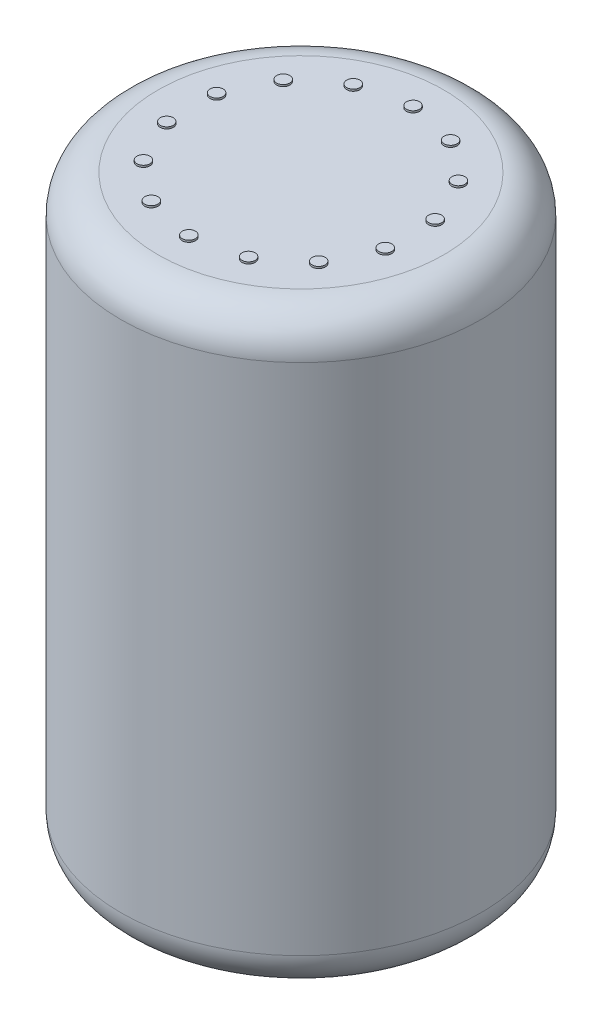
ISO-10303-21;
HEADER;
FILE_DESCRIPTION(('STEP AP214'),'2;1');
FILE_NAME('part.step','',(''),(''),'','','');
FILE_SCHEMA(('AUTOMOTIVE_DESIGN { 1 0 10303 214 1 1 1 1 }'));
ENDSEC;
DATA;
#1=APPLICATION_CONTEXT('core data for automotive mechanical design processes');
#2=APPLICATION_PROTOCOL_DEFINITION('international standard','automotive_design',2000,#1);
#3=PRODUCT_CONTEXT('',#1,'mechanical');
#4=PRODUCT('Part','Part','',(#3));
#5=PRODUCT_RELATED_PRODUCT_CATEGORY('part','',(#4));
#6=PRODUCT_DEFINITION_FORMATION('','',#4);
#7=PRODUCT_DEFINITION_CONTEXT('part definition',#1,'design');
#8=PRODUCT_DEFINITION('design','',#6,#7);
#9=PRODUCT_DEFINITION_SHAPE('','',#8);
#10=(LENGTH_UNIT() NAMED_UNIT(*) SI_UNIT(.MILLI.,.METRE.));
#11=(NAMED_UNIT(*) PLANE_ANGLE_UNIT() SI_UNIT($,.RADIAN.));
#12=(NAMED_UNIT(*) SI_UNIT($,.STERADIAN.) SOLID_ANGLE_UNIT());
#13=UNCERTAINTY_MEASURE_WITH_UNIT(LENGTH_MEASURE(1.E-05),#10,'distance_accuracy_value','');
#14=(GEOMETRIC_REPRESENTATION_CONTEXT(3) GLOBAL_UNCERTAINTY_ASSIGNED_CONTEXT((#13)) GLOBAL_UNIT_ASSIGNED_CONTEXT((#10,
#11,#12)) REPRESENTATION_CONTEXT('',''));
#15=CARTESIAN_POINT('',(0.,0.,0.));
#16=DIRECTION('',(0.,0.,1.));
#17=DIRECTION('',(1.,0.,0.));
#18=AXIS2_PLACEMENT_3D('',#15,#16,#17);
#19=CARTESIAN_POINT('',(0.,31.5,0.));
#20=DIRECTION('',(0.,1.,0.));
#21=DIRECTION('',(0.,0.,1.));
#22=AXIS2_PLACEMENT_3D('',#19,#20,#21);
#23=PLANE('',#22);
#24=CARTESIAN_POINT('',(4.69098889480813,31.5,-3.74093881115246));
#25=DIRECTION('',(0.,1.,0.));
#26=DIRECTION('',(-0.781831482468022,0.,0.623489801858743));
#27=AXIS2_PLACEMENT_3D('',#24,#25,#26);
#28=CIRCLE('',#27,0.35);
#29=CARTESIAN_POINT('',(4.41734787594433,31.5,-3.5227173805019));
#30=VERTEX_POINT('',#29);
#31=EDGE_CURVE('E127',#30,#30,#28,.T.);
#32=ORIENTED_EDGE('',*,*,#31,.F.);
#33=EDGE_LOOP('',(#32));
#34=FACE_BOUND('',#33,.T.);
#35=CARTESIAN_POINT('',(5.84956747309095,31.5,1.33512560373783));
#36=DIRECTION('',(0.,1.,0.));
#37=DIRECTION('',(-0.974927912181826,0.,-0.222520933956305));
#38=AXIS2_PLACEMENT_3D('',#35,#36,#37);
#39=CIRCLE('',#38,0.35);
#40=CARTESIAN_POINT('',(5.50834270382732,31.5,1.25724327685312));
#41=VERTEX_POINT('',#40);
#42=EDGE_CURVE('E115',#41,#41,#39,.T.);
#43=ORIENTED_EDGE('',*,*,#42,.F.);
#44=EDGE_LOOP('',(#43));
#45=FACE_BOUND('',#44,.T.);
#46=CARTESIAN_POINT('',(2.60330243470539,31.5,5.40581320741449));
#47=DIRECTION('',(0.,1.,0.));
#48=DIRECTION('',(-0.433883739117565,0.,-0.900968867902416));
#49=AXIS2_PLACEMENT_3D('',#46,#47,#48);
#50=CIRCLE('',#49,0.35);
#51=CARTESIAN_POINT('',(2.45144312601424,31.5,5.09047410364865));
#52=VERTEX_POINT('',#51);
#53=EDGE_CURVE('E103',#52,#52,#50,.T.);
#54=ORIENTED_EDGE('',*,*,#53,.F.);
#55=EDGE_LOOP('',(#54));
#56=FACE_BOUND('',#55,.T.);
#57=CARTESIAN_POINT('',(-2.60330243470532,31.5,5.40581320741453));
#58=DIRECTION('',(0.,1.,0.));
#59=DIRECTION('',(0.433883739117553,0.,-0.900968867902422));
#60=AXIS2_PLACEMENT_3D('',#57,#58,#59);
#61=CIRCLE('',#60,0.35);
#62=CARTESIAN_POINT('',(-2.45144312601417,31.5,5.09047410364868));
#63=VERTEX_POINT('',#62);
#64=EDGE_CURVE('E91',#63,#63,#61,.T.);
#65=ORIENTED_EDGE('',*,*,#64,.F.);
#66=EDGE_LOOP('',(#65));
#67=FACE_BOUND('',#66,.T.);
#68=CARTESIAN_POINT('',(-5.84956747309094,31.5,1.33512560373791));
#69=DIRECTION('',(0.,1.,0.));
#70=DIRECTION('',(0.974927912181823,0.,-0.222520933956318));
#71=AXIS2_PLACEMENT_3D('',#68,#69,#70);
#72=CIRCLE('',#71,0.35);
#73=CARTESIAN_POINT('',(-5.5083427038273,31.5,1.2572432768532));
#74=VERTEX_POINT('',#73);
#75=EDGE_CURVE('E79',#74,#74,#72,.T.);
#76=ORIENTED_EDGE('',*,*,#75,.F.);
#77=EDGE_LOOP('',(#76));
#78=FACE_BOUND('',#77,.T.);
#79=CARTESIAN_POINT('',(-4.69098889480819,31.5,-3.74093881115239));
#80=DIRECTION('',(0.,1.,0.));
#81=DIRECTION('',(0.781831482468031,0.,0.623489801858732));
#82=AXIS2_PLACEMENT_3D('',#79,#80,#81);
#83=CIRCLE('',#82,0.35);
#84=CARTESIAN_POINT('',(-4.41734787594437,31.5,-3.52271738050184));
#85=VERTEX_POINT('',#84);
#86=EDGE_CURVE('E67',#85,#85,#83,.T.);
#87=ORIENTED_EDGE('',*,*,#86,.F.);
#88=EDGE_LOOP('',(#87));
#89=FACE_BOUND('',#88,.T.);
#90=CARTESIAN_POINT('',(0.,31.5,-6.));
#91=DIRECTION('',(0.,1.,0.));
#92=DIRECTION('',(0.,0.,1.));
#93=AXIS2_PLACEMENT_3D('',#90,#91,#92);
#94=CIRCLE('',#93,0.35);
#95=CARTESIAN_POINT('',(0.,31.5,-5.65));
#96=VERTEX_POINT('',#95);
#97=EDGE_CURVE('E53',#96,#96,#94,.T.);
#98=ORIENTED_EDGE('',*,*,#97,.F.);
#99=EDGE_LOOP('',(#98));
#100=FACE_BOUND('',#99,.T.);
#101=CARTESIAN_POINT('',(0.,31.5,0.));
#102=DIRECTION('',(0.,1.,0.));
#103=DIRECTION('',(0.,0.,1.));
#104=AXIS2_PLACEMENT_3D('',#101,#102,#103);
#105=CIRCLE('',#104,7.65);
#106=CARTESIAN_POINT('',(0.,31.5,7.65));
#107=VERTEX_POINT('',#106);
#108=EDGE_CURVE('E10',#107,#107,#105,.T.);
#109=ORIENTED_EDGE('',*,*,#108,.T.);
#110=EDGE_LOOP('',(#109));
#111=FACE_BOUND('',#110,.T.);
#112=CARTESIAN_POINT('',(-2.60330243470535,31.5,-5.40581320741451));
#113=DIRECTION('',(0.,1.,0.));
#114=DIRECTION('',(0.433883739117559,0.,0.900968867902419));
#115=AXIS2_PLACEMENT_3D('',#112,#113,#114);
#116=CIRCLE('',#115,0.35);
#117=CARTESIAN_POINT('',(-2.45144312601421,31.5,-5.09047410364867));
#118=VERTEX_POINT('',#117);
#119=EDGE_CURVE('E61',#118,#118,#116,.T.);
#120=ORIENTED_EDGE('',*,*,#119,.F.);
#121=EDGE_LOOP('',(#120));
#122=FACE_BOUND('',#121,.T.);
#123=CARTESIAN_POINT('',(-5.84956747309095,31.5,-1.33512560373787));
#124=DIRECTION('',(0.,1.,0.));
#125=DIRECTION('',(0.974927912181824,0.,0.222520933956311));
#126=AXIS2_PLACEMENT_3D('',#123,#124,#125);
#127=CIRCLE('',#126,0.35);
#128=CARTESIAN_POINT('',(-5.50834270382731,31.5,-1.25724327685316));
#129=VERTEX_POINT('',#128);
#130=EDGE_CURVE('E73',#129,#129,#127,.T.);
#131=ORIENTED_EDGE('',*,*,#130,.F.);
#132=EDGE_LOOP('',(#131));
#133=FACE_BOUND('',#132,.T.);
#134=CARTESIAN_POINT('',(-4.69098889480816,31.5,3.74093881115242));
#135=DIRECTION('',(0.,1.,0.));
#136=DIRECTION('',(0.781831482468027,0.,-0.623489801858737));
#137=AXIS2_PLACEMENT_3D('',#134,#135,#136);
#138=CIRCLE('',#137,0.35);
#139=CARTESIAN_POINT('',(-4.41734787594435,31.5,3.52271738050187));
#140=VERTEX_POINT('',#139);
#141=EDGE_CURVE('E85',#140,#140,#138,.T.);
#142=ORIENTED_EDGE('',*,*,#141,.F.);
#143=EDGE_LOOP('',(#142));
#144=FACE_BOUND('',#143,.T.);
#145=CARTESIAN_POINT('',(0.,31.5,6.));
#146=DIRECTION('',(0.,1.,0.));
#147=DIRECTION('',(0.,0.,-1.));
#148=AXIS2_PLACEMENT_3D('',#145,#146,#147);
#149=CIRCLE('',#148,0.35);
#150=CARTESIAN_POINT('',(0.,31.5,5.65));
#151=VERTEX_POINT('',#150);
#152=EDGE_CURVE('E97',#151,#151,#149,.T.);
#153=ORIENTED_EDGE('',*,*,#152,.F.);
#154=EDGE_LOOP('',(#153));
#155=FACE_BOUND('',#154,.T.);
#156=CARTESIAN_POINT('',(4.69098889480821,31.5,3.74093881115236));
#157=DIRECTION('',(0.,1.,0.));
#158=DIRECTION('',(-0.781831482468035,0.,-0.623489801858727));
#159=AXIS2_PLACEMENT_3D('',#156,#157,#158);
#160=CIRCLE('',#159,0.35);
#161=CARTESIAN_POINT('',(4.4173478759444,31.5,3.52271738050181));
#162=VERTEX_POINT('',#161);
#163=EDGE_CURVE('E109',#162,#162,#160,.T.);
#164=ORIENTED_EDGE('',*,*,#163,.F.);
#165=EDGE_LOOP('',(#164));
#166=FACE_BOUND('',#165,.T.);
#167=CARTESIAN_POINT('',(5.84956747309093,31.5,-1.33512560373795));
#168=DIRECTION('',(0.,1.,0.));
#169=DIRECTION('',(-0.974927912181821,0.,0.222520933956325));
#170=AXIS2_PLACEMENT_3D('',#167,#168,#169);
#171=CIRCLE('',#170,0.35);
#172=CARTESIAN_POINT('',(5.50834270382729,31.5,-1.25724327685323));
#173=VERTEX_POINT('',#172);
#174=EDGE_CURVE('E121',#173,#173,#171,.T.);
#175=ORIENTED_EDGE('',*,*,#174,.F.);
#176=EDGE_LOOP('',(#175));
#177=FACE_BOUND('',#176,.T.);
#178=CARTESIAN_POINT('',(2.60330243470528,31.5,-5.40581320741455));
#179=DIRECTION('',(0.,1.,0.));
#180=DIRECTION('',(-0.433883739117546,0.,0.900968867902425));
#181=AXIS2_PLACEMENT_3D('',#178,#179,#180);
#182=CIRCLE('',#181,0.35);
#183=CARTESIAN_POINT('',(2.45144312601414,31.5,-5.0904741036487));
#184=VERTEX_POINT('',#183);
#185=EDGE_CURVE('E133',#184,#184,#182,.T.);
#186=ORIENTED_EDGE('',*,*,#185,.F.);
#187=EDGE_LOOP('',(#186));
#188=FACE_BOUND('',#187,.T.);
#189=ADVANCED_FACE('F32',(#34,#45,#56,#67,#78,#89,#100,#111,#122,#133,#144,#155,#166,#177,#188),
#23,.T.);
#190=CARTESIAN_POINT('',(0.,31.5,0.));
#191=DIRECTION('',(0.,-1.,0.));
#192=DIRECTION('',(0.,0.,-1.));
#193=AXIS2_PLACEMENT_3D('',#190,#191,#192);
#194=CYLINDRICAL_SURFACE('',#193,9.65);
#195=CARTESIAN_POINT('',(0.,2.,0.));
#196=DIRECTION('',(0.,1.,0.));
#197=DIRECTION('',(0.,0.,1.));
#198=AXIS2_PLACEMENT_3D('',#195,#196,#197);
#199=CIRCLE('',#198,9.65);
#200=CARTESIAN_POINT('',(0.,2.,9.65));
#201=VERTEX_POINT('',#200);
#202=EDGE_CURVE('E43',#201,#201,#199,.T.);
#203=ORIENTED_EDGE('',*,*,#202,.T.);
#204=EDGE_LOOP('',(#203));
#205=FACE_BOUND('',#204,.T.);
#206=CARTESIAN_POINT('',(0.,29.5,0.));
#207=DIRECTION('',(0.,1.,0.));
#208=DIRECTION('',(0.,0.,1.));
#209=AXIS2_PLACEMENT_3D('',#206,#207,#208);
#210=CIRCLE('',#209,9.65);
#211=CARTESIAN_POINT('',(0.,29.5,9.65));
#212=VERTEX_POINT('',#211);
#213=EDGE_CURVE('E47',#212,#212,#210,.F.);
#214=ORIENTED_EDGE('',*,*,#213,.T.);
#215=EDGE_LOOP('',(#214));
#216=FACE_BOUND('',#215,.T.);
#217=ADVANCED_FACE('F140',(#205,#216),#194,.T.);
#218=CARTESIAN_POINT('',(0.,0.,0.));
#219=DIRECTION('',(0.,1.,0.));
#220=DIRECTION('',(0.,0.,1.));
#221=AXIS2_PLACEMENT_3D('',#218,#219,#220);
#222=PLANE('',#221);
#223=CARTESIAN_POINT('',(0.,0.,0.));
#224=DIRECTION('',(0.,1.,0.));
#225=DIRECTION('',(0.,0.,1.));
#226=AXIS2_PLACEMENT_3D('',#223,#224,#225);
#227=CIRCLE('',#226,7.65);
#228=CARTESIAN_POINT('',(0.,0.,7.65));
#229=VERTEX_POINT('',#228);
#230=EDGE_CURVE('E39',#229,#229,#227,.F.);
#231=ORIENTED_EDGE('',*,*,#230,.T.);
#232=EDGE_LOOP('',(#231));
#233=FACE_BOUND('',#232,.T.);
#234=ADVANCED_FACE('F146',(#233),#222,.F.);
#235=CARTESIAN_POINT('',(0.,2.,0.));
#236=DIRECTION('',(0.,1.,0.));
#237=DIRECTION('',(0.,0.,1.));
#238=AXIS2_PLACEMENT_3D('',#235,#236,#237);
#239=TOROIDAL_SURFACE('',#238,7.65,2.);
#240=ORIENTED_EDGE('',*,*,#230,.F.);
#241=EDGE_LOOP('',(#240));
#242=FACE_BOUND('',#241,.T.);
#243=ORIENTED_EDGE('',*,*,#202,.F.);
#244=EDGE_LOOP('',(#243));
#245=FACE_BOUND('',#244,.T.);
#246=ADVANCED_FACE('F156',(#242,#245),#239,.T.);
#247=CARTESIAN_POINT('',(0.,29.5,0.));
#248=DIRECTION('',(0.,1.,0.));
#249=DIRECTION('',(0.,0.,1.));
#250=AXIS2_PLACEMENT_3D('',#247,#248,#249);
#251=TOROIDAL_SURFACE('',#250,7.65,2.);
#252=ORIENTED_EDGE('',*,*,#213,.F.);
#253=EDGE_LOOP('',(#252));
#254=FACE_BOUND('',#253,.T.);
#255=ORIENTED_EDGE('',*,*,#108,.F.);
#256=EDGE_LOOP('',(#255));
#257=FACE_BOUND('',#256,.T.);
#258=ADVANCED_FACE('F34',(#254,#257),#251,.T.);
#259=CARTESIAN_POINT('',(0.,31.6,-6.));
#260=DIRECTION('',(0.,-1.,0.));
#261=DIRECTION('',(0.,0.,-1.));
#262=AXIS2_PLACEMENT_3D('',#259,#260,#261);
#263=CYLINDRICAL_SURFACE('',#262,0.35);
#264=CARTESIAN_POINT('',(0.,31.6,-6.));
#265=DIRECTION('',(0.,1.,0.));
#266=DIRECTION('',(0.,0.,1.));
#267=AXIS2_PLACEMENT_3D('',#264,#265,#266);
#268=CIRCLE('',#267,0.35);
#269=CARTESIAN_POINT('',(0.,31.6,-5.65));
#270=VERTEX_POINT('',#269);
#271=EDGE_CURVE('E52',#270,#270,#268,.T.);
#272=ORIENTED_EDGE('',*,*,#271,.F.);
#273=EDGE_LOOP('',(#272));
#274=FACE_BOUND('',#273,.T.);
#275=ORIENTED_EDGE('',*,*,#97,.T.);
#276=EDGE_LOOP('',(#275));
#277=FACE_BOUND('',#276,.T.);
#278=ADVANCED_FACE('F153',(#274,#277),#263,.T.);
#279=CARTESIAN_POINT('',(0.,31.6,-6.));
#280=DIRECTION('',(0.,1.,0.));
#281=DIRECTION('',(0.,0.,1.));
#282=AXIS2_PLACEMENT_3D('',#279,#280,#281);
#283=PLANE('',#282);
#284=ORIENTED_EDGE('',*,*,#271,.T.);
#285=EDGE_LOOP('',(#284));
#286=FACE_BOUND('',#285,.T.);
#287=ADVANCED_FACE('F171',(#286),#283,.T.);
#288=CARTESIAN_POINT('',(-2.60330243470535,31.6,-5.40581320741451));
#289=DIRECTION('',(0.,-1.,0.));
#290=DIRECTION('',(-0.433883739117559,0.,-0.900968867902419));
#291=AXIS2_PLACEMENT_3D('',#288,#289,#290);
#292=CYLINDRICAL_SURFACE('',#291,0.35);
#293=CARTESIAN_POINT('',(-2.60330243470535,31.6,-5.40581320741451));
#294=DIRECTION('',(0.,1.,0.));
#295=DIRECTION('',(0.433883739117559,0.,0.900968867902419));
#296=AXIS2_PLACEMENT_3D('',#293,#294,#295);
#297=CIRCLE('',#296,0.35);
#298=CARTESIAN_POINT('',(-2.45144312601421,31.6,-5.09047410364867));
#299=VERTEX_POINT('',#298);
#300=EDGE_CURVE('E56',#299,#299,#297,.T.);
#301=ORIENTED_EDGE('',*,*,#300,.F.);
#302=EDGE_LOOP('',(#301));
#303=FACE_BOUND('',#302,.T.);
#304=ORIENTED_EDGE('',*,*,#119,.T.);
#305=EDGE_LOOP('',(#304));
#306=FACE_BOUND('',#305,.T.);
#307=ADVANCED_FACE('F176',(#303,#306),#292,.T.);
#308=CARTESIAN_POINT('',(-2.60330243470535,31.6,-5.40581320741451));
#309=DIRECTION('',(0.,1.,0.));
#310=DIRECTION('',(0.433883739117559,0.,0.900968867902419));
#311=AXIS2_PLACEMENT_3D('',#308,#309,#310);
#312=PLANE('',#311);
#313=ORIENTED_EDGE('',*,*,#300,.T.);
#314=EDGE_LOOP('',(#313));
#315=FACE_BOUND('',#314,.T.);
#316=ADVANCED_FACE('F280',(#315),#312,.T.);
#317=CARTESIAN_POINT('',(-4.69098889480819,31.6,-3.74093881115239));
#318=DIRECTION('',(0.,-1.,0.));
#319=DIRECTION('',(-0.781831482468031,0.,-0.623489801858732));
#320=AXIS2_PLACEMENT_3D('',#317,#318,#319);
#321=CYLINDRICAL_SURFACE('',#320,0.35);
#322=CARTESIAN_POINT('',(-4.69098889480819,31.6,-3.74093881115239));
#323=DIRECTION('',(0.,1.,0.));
#324=DIRECTION('',(0.781831482468031,0.,0.623489801858732));
#325=AXIS2_PLACEMENT_3D('',#322,#323,#324);
#326=CIRCLE('',#325,0.35);
#327=CARTESIAN_POINT('',(-4.41734787594437,31.6,-3.52271738050184));
#328=VERTEX_POINT('',#327);
#329=EDGE_CURVE('E64',#328,#328,#326,.T.);
#330=ORIENTED_EDGE('',*,*,#329,.F.);
#331=EDGE_LOOP('',(#330));
#332=FACE_BOUND('',#331,.T.);
#333=ORIENTED_EDGE('',*,*,#86,.T.);
#334=EDGE_LOOP('',(#333));
#335=FACE_BOUND('',#334,.T.);
#336=ADVANCED_FACE('F276',(#332,#335),#321,.T.);
#337=CARTESIAN_POINT('',(-4.69098889480819,31.6,-3.74093881115239));
#338=DIRECTION('',(0.,1.,0.));
#339=DIRECTION('',(0.781831482468031,0.,0.623489801858732));
#340=AXIS2_PLACEMENT_3D('',#337,#338,#339);
#341=PLANE('',#340);
#342=ORIENTED_EDGE('',*,*,#329,.T.);
#343=EDGE_LOOP('',(#342));
#344=FACE_BOUND('',#343,.T.);
#345=ADVANCED_FACE('F272',(#344),#341,.T.);
#346=CARTESIAN_POINT('',(-5.84956747309095,31.6,-1.33512560373787));
#347=DIRECTION('',(0.,-1.,0.));
#348=DIRECTION('',(-0.974927912181824,0.,-0.222520933956311));
#349=AXIS2_PLACEMENT_3D('',#346,#347,#348);
#350=CYLINDRICAL_SURFACE('',#349,0.35);
#351=CARTESIAN_POINT('',(-5.84956747309095,31.6,-1.33512560373787));
#352=DIRECTION('',(0.,1.,0.));
#353=DIRECTION('',(0.974927912181824,0.,0.222520933956311));
#354=AXIS2_PLACEMENT_3D('',#351,#352,#353);
#355=CIRCLE('',#354,0.35);
#356=CARTESIAN_POINT('',(-5.50834270382731,31.6,-1.25724327685316));
#357=VERTEX_POINT('',#356);
#358=EDGE_CURVE('E70',#357,#357,#355,.T.);
#359=ORIENTED_EDGE('',*,*,#358,.F.);
#360=EDGE_LOOP('',(#359));
#361=FACE_BOUND('',#360,.T.);
#362=ORIENTED_EDGE('',*,*,#130,.T.);
#363=EDGE_LOOP('',(#362));
#364=FACE_BOUND('',#363,.T.);
#365=ADVANCED_FACE('F268',(#361,#364),#350,.T.);
#366=CARTESIAN_POINT('',(-5.84956747309095,31.6,-1.33512560373787));
#367=DIRECTION('',(0.,1.,0.));
#368=DIRECTION('',(0.974927912181824,0.,0.222520933956311));
#369=AXIS2_PLACEMENT_3D('',#366,#367,#368);
#370=PLANE('',#369);
#371=ORIENTED_EDGE('',*,*,#358,.T.);
#372=EDGE_LOOP('',(#371));
#373=FACE_BOUND('',#372,.T.);
#374=ADVANCED_FACE('F264',(#373),#370,.T.);
#375=CARTESIAN_POINT('',(-5.84956747309094,31.6,1.33512560373791));
#376=DIRECTION('',(0.,-1.,0.));
#377=DIRECTION('',(-0.974927912181823,0.,0.222520933956318));
#378=AXIS2_PLACEMENT_3D('',#375,#376,#377);
#379=CYLINDRICAL_SURFACE('',#378,0.35);
#380=CARTESIAN_POINT('',(-5.84956747309094,31.6,1.33512560373791));
#381=DIRECTION('',(0.,1.,0.));
#382=DIRECTION('',(0.974927912181823,0.,-0.222520933956318));
#383=AXIS2_PLACEMENT_3D('',#380,#381,#382);
#384=CIRCLE('',#383,0.35);
#385=CARTESIAN_POINT('',(-5.5083427038273,31.6,1.2572432768532));
#386=VERTEX_POINT('',#385);
#387=EDGE_CURVE('E76',#386,#386,#384,.T.);
#388=ORIENTED_EDGE('',*,*,#387,.F.);
#389=EDGE_LOOP('',(#388));
#390=FACE_BOUND('',#389,.T.);
#391=ORIENTED_EDGE('',*,*,#75,.T.);
#392=EDGE_LOOP('',(#391));
#393=FACE_BOUND('',#392,.T.);
#394=ADVANCED_FACE('F260',(#390,#393),#379,.T.);
#395=CARTESIAN_POINT('',(-5.84956747309094,31.6,1.33512560373791));
#396=DIRECTION('',(0.,1.,0.));
#397=DIRECTION('',(0.974927912181823,0.,-0.222520933956318));
#398=AXIS2_PLACEMENT_3D('',#395,#396,#397);
#399=PLANE('',#398);
#400=ORIENTED_EDGE('',*,*,#387,.T.);
#401=EDGE_LOOP('',(#400));
#402=FACE_BOUND('',#401,.T.);
#403=ADVANCED_FACE('F256',(#402),#399,.T.);
#404=CARTESIAN_POINT('',(-4.69098889480816,31.6,3.74093881115242));
#405=DIRECTION('',(0.,-1.,0.));
#406=DIRECTION('',(-0.781831482468027,0.,0.623489801858737));
#407=AXIS2_PLACEMENT_3D('',#404,#405,#406);
#408=CYLINDRICAL_SURFACE('',#407,0.35);
#409=CARTESIAN_POINT('',(-4.69098889480816,31.6,3.74093881115242));
#410=DIRECTION('',(0.,1.,0.));
#411=DIRECTION('',(0.781831482468027,0.,-0.623489801858737));
#412=AXIS2_PLACEMENT_3D('',#409,#410,#411);
#413=CIRCLE('',#412,0.35);
#414=CARTESIAN_POINT('',(-4.41734787594435,31.6,3.52271738050187));
#415=VERTEX_POINT('',#414);
#416=EDGE_CURVE('E82',#415,#415,#413,.T.);
#417=ORIENTED_EDGE('',*,*,#416,.F.);
#418=EDGE_LOOP('',(#417));
#419=FACE_BOUND('',#418,.T.);
#420=ORIENTED_EDGE('',*,*,#141,.T.);
#421=EDGE_LOOP('',(#420));
#422=FACE_BOUND('',#421,.T.);
#423=ADVANCED_FACE('F252',(#419,#422),#408,.T.);
#424=CARTESIAN_POINT('',(-4.69098889480816,31.6,3.74093881115242));
#425=DIRECTION('',(0.,1.,0.));
#426=DIRECTION('',(0.781831482468027,0.,-0.623489801858737));
#427=AXIS2_PLACEMENT_3D('',#424,#425,#426);
#428=PLANE('',#427);
#429=ORIENTED_EDGE('',*,*,#416,.T.);
#430=EDGE_LOOP('',(#429));
#431=FACE_BOUND('',#430,.T.);
#432=ADVANCED_FACE('F248',(#431),#428,.T.);
#433=CARTESIAN_POINT('',(-2.60330243470532,31.6,5.40581320741453));
#434=DIRECTION('',(0.,-1.,0.));
#435=DIRECTION('',(-0.433883739117553,0.,0.900968867902422));
#436=AXIS2_PLACEMENT_3D('',#433,#434,#435);
#437=CYLINDRICAL_SURFACE('',#436,0.35);
#438=CARTESIAN_POINT('',(-2.60330243470532,31.6,5.40581320741453));
#439=DIRECTION('',(0.,1.,0.));
#440=DIRECTION('',(0.433883739117553,0.,-0.900968867902422));
#441=AXIS2_PLACEMENT_3D('',#438,#439,#440);
#442=CIRCLE('',#441,0.35);
#443=CARTESIAN_POINT('',(-2.45144312601417,31.6,5.09047410364868));
#444=VERTEX_POINT('',#443);
#445=EDGE_CURVE('E88',#444,#444,#442,.T.);
#446=ORIENTED_EDGE('',*,*,#445,.F.);
#447=EDGE_LOOP('',(#446));
#448=FACE_BOUND('',#447,.T.);
#449=ORIENTED_EDGE('',*,*,#64,.T.);
#450=EDGE_LOOP('',(#449));
#451=FACE_BOUND('',#450,.T.);
#452=ADVANCED_FACE('F244',(#448,#451),#437,.T.);
#453=CARTESIAN_POINT('',(-2.60330243470532,31.6,5.40581320741453));
#454=DIRECTION('',(0.,1.,0.));
#455=DIRECTION('',(0.433883739117553,0.,-0.900968867902422));
#456=AXIS2_PLACEMENT_3D('',#453,#454,#455);
#457=PLANE('',#456);
#458=ORIENTED_EDGE('',*,*,#445,.T.);
#459=EDGE_LOOP('',(#458));
#460=FACE_BOUND('',#459,.T.);
#461=ADVANCED_FACE('F240',(#460),#457,.T.);
#462=CARTESIAN_POINT('',(0.,31.6,6.));
#463=DIRECTION('',(0.,-1.,0.));
#464=DIRECTION('',(0.,0.,1.));
#465=AXIS2_PLACEMENT_3D('',#462,#463,#464);
#466=CYLINDRICAL_SURFACE('',#465,0.35);
#467=CARTESIAN_POINT('',(0.,31.6,6.));
#468=DIRECTION('',(0.,1.,0.));
#469=DIRECTION('',(0.,0.,-1.));
#470=AXIS2_PLACEMENT_3D('',#467,#468,#469);
#471=CIRCLE('',#470,0.35);
#472=CARTESIAN_POINT('',(0.,31.6,5.65));
#473=VERTEX_POINT('',#472);
#474=EDGE_CURVE('E94',#473,#473,#471,.T.);
#475=ORIENTED_EDGE('',*,*,#474,.F.);
#476=EDGE_LOOP('',(#475));
#477=FACE_BOUND('',#476,.T.);
#478=ORIENTED_EDGE('',*,*,#152,.T.);
#479=EDGE_LOOP('',(#478));
#480=FACE_BOUND('',#479,.T.);
#481=ADVANCED_FACE('F236',(#477,#480),#466,.T.);
#482=CARTESIAN_POINT('',(0.,31.6,6.));
#483=DIRECTION('',(0.,1.,0.));
#484=DIRECTION('',(0.,0.,-1.));
#485=AXIS2_PLACEMENT_3D('',#482,#483,#484);
#486=PLANE('',#485);
#487=ORIENTED_EDGE('',*,*,#474,.T.);
#488=EDGE_LOOP('',(#487));
#489=FACE_BOUND('',#488,.T.);
#490=ADVANCED_FACE('F232',(#489),#486,.T.);
#491=CARTESIAN_POINT('',(2.60330243470539,31.6,5.40581320741449));
#492=DIRECTION('',(0.,-1.,0.));
#493=DIRECTION('',(0.433883739117565,0.,0.900968867902416));
#494=AXIS2_PLACEMENT_3D('',#491,#492,#493);
#495=CYLINDRICAL_SURFACE('',#494,0.35);
#496=CARTESIAN_POINT('',(2.60330243470539,31.6,5.40581320741449));
#497=DIRECTION('',(0.,1.,0.));
#498=DIRECTION('',(-0.433883739117565,0.,-0.900968867902416));
#499=AXIS2_PLACEMENT_3D('',#496,#497,#498);
#500=CIRCLE('',#499,0.35);
#501=CARTESIAN_POINT('',(2.45144312601424,31.6,5.09047410364865));
#502=VERTEX_POINT('',#501);
#503=EDGE_CURVE('E100',#502,#502,#500,.T.);
#504=ORIENTED_EDGE('',*,*,#503,.F.);
#505=EDGE_LOOP('',(#504));
#506=FACE_BOUND('',#505,.T.);
#507=ORIENTED_EDGE('',*,*,#53,.T.);
#508=EDGE_LOOP('',(#507));
#509=FACE_BOUND('',#508,.T.);
#510=ADVANCED_FACE('F228',(#506,#509),#495,.T.);
#511=CARTESIAN_POINT('',(2.60330243470539,31.6,5.40581320741449));
#512=DIRECTION('',(0.,1.,0.));
#513=DIRECTION('',(-0.433883739117565,0.,-0.900968867902416));
#514=AXIS2_PLACEMENT_3D('',#511,#512,#513);
#515=PLANE('',#514);
#516=ORIENTED_EDGE('',*,*,#503,.T.);
#517=EDGE_LOOP('',(#516));
#518=FACE_BOUND('',#517,.T.);
#519=ADVANCED_FACE('F224',(#518),#515,.T.);
#520=CARTESIAN_POINT('',(4.69098889480821,31.6,3.74093881115236));
#521=DIRECTION('',(0.,-1.,0.));
#522=DIRECTION('',(0.781831482468035,0.,0.623489801858727));
#523=AXIS2_PLACEMENT_3D('',#520,#521,#522);
#524=CYLINDRICAL_SURFACE('',#523,0.35);
#525=CARTESIAN_POINT('',(4.69098889480821,31.6,3.74093881115236));
#526=DIRECTION('',(0.,1.,0.));
#527=DIRECTION('',(-0.781831482468035,0.,-0.623489801858727));
#528=AXIS2_PLACEMENT_3D('',#525,#526,#527);
#529=CIRCLE('',#528,0.35);
#530=CARTESIAN_POINT('',(4.4173478759444,31.6,3.52271738050181));
#531=VERTEX_POINT('',#530);
#532=EDGE_CURVE('E106',#531,#531,#529,.T.);
#533=ORIENTED_EDGE('',*,*,#532,.F.);
#534=EDGE_LOOP('',(#533));
#535=FACE_BOUND('',#534,.T.);
#536=ORIENTED_EDGE('',*,*,#163,.T.);
#537=EDGE_LOOP('',(#536));
#538=FACE_BOUND('',#537,.T.);
#539=ADVANCED_FACE('F220',(#535,#538),#524,.T.);
#540=CARTESIAN_POINT('',(4.69098889480821,31.6,3.74093881115236));
#541=DIRECTION('',(0.,1.,0.));
#542=DIRECTION('',(-0.781831482468035,0.,-0.623489801858727));
#543=AXIS2_PLACEMENT_3D('',#540,#541,#542);
#544=PLANE('',#543);
#545=ORIENTED_EDGE('',*,*,#532,.T.);
#546=EDGE_LOOP('',(#545));
#547=FACE_BOUND('',#546,.T.);
#548=ADVANCED_FACE('F216',(#547),#544,.T.);
#549=CARTESIAN_POINT('',(5.84956747309095,31.6,1.33512560373783));
#550=DIRECTION('',(0.,-1.,0.));
#551=DIRECTION('',(0.974927912181826,0.,0.222520933956305));
#552=AXIS2_PLACEMENT_3D('',#549,#550,#551);
#553=CYLINDRICAL_SURFACE('',#552,0.35);
#554=CARTESIAN_POINT('',(5.84956747309095,31.6,1.33512560373783));
#555=DIRECTION('',(0.,1.,0.));
#556=DIRECTION('',(-0.974927912181826,0.,-0.222520933956305));
#557=AXIS2_PLACEMENT_3D('',#554,#555,#556);
#558=CIRCLE('',#557,0.35);
#559=CARTESIAN_POINT('',(5.50834270382732,31.6,1.25724327685312));
#560=VERTEX_POINT('',#559);
#561=EDGE_CURVE('E112',#560,#560,#558,.T.);
#562=ORIENTED_EDGE('',*,*,#561,.F.);
#563=EDGE_LOOP('',(#562));
#564=FACE_BOUND('',#563,.T.);
#565=ORIENTED_EDGE('',*,*,#42,.T.);
#566=EDGE_LOOP('',(#565));
#567=FACE_BOUND('',#566,.T.);
#568=ADVANCED_FACE('F208',(#564,#567),#553,.T.);
#569=CARTESIAN_POINT('',(5.84956747309095,31.6,1.33512560373783));
#570=DIRECTION('',(0.,1.,0.));
#571=DIRECTION('',(-0.974927912181826,0.,-0.222520933956305));
#572=AXIS2_PLACEMENT_3D('',#569,#570,#571);
#573=PLANE('',#572);
#574=ORIENTED_EDGE('',*,*,#561,.T.);
#575=EDGE_LOOP('',(#574));
#576=FACE_BOUND('',#575,.T.);
#577=ADVANCED_FACE('F198',(#576),#573,.T.);
#578=CARTESIAN_POINT('',(5.84956747309093,31.6,-1.33512560373795));
#579=DIRECTION('',(0.,-1.,0.));
#580=DIRECTION('',(0.974927912181821,0.,-0.222520933956325));
#581=AXIS2_PLACEMENT_3D('',#578,#579,#580);
#582=CYLINDRICAL_SURFACE('',#581,0.35);
#583=CARTESIAN_POINT('',(5.84956747309093,31.6,-1.33512560373795));
#584=DIRECTION('',(0.,1.,0.));
#585=DIRECTION('',(-0.974927912181821,0.,0.222520933956325));
#586=AXIS2_PLACEMENT_3D('',#583,#584,#585);
#587=CIRCLE('',#586,0.35);
#588=CARTESIAN_POINT('',(5.50834270382729,31.6,-1.25724327685323));
#589=VERTEX_POINT('',#588);
#590=EDGE_CURVE('E118',#589,#589,#587,.T.);
#591=ORIENTED_EDGE('',*,*,#590,.F.);
#592=EDGE_LOOP('',(#591));
#593=FACE_BOUND('',#592,.T.);
#594=ORIENTED_EDGE('',*,*,#174,.T.);
#595=EDGE_LOOP('',(#594));
#596=FACE_BOUND('',#595,.T.);
#597=ADVANCED_FACE('F195',(#593,#596),#582,.T.);
#598=CARTESIAN_POINT('',(5.84956747309093,31.6,-1.33512560373795));
#599=DIRECTION('',(0.,1.,0.));
#600=DIRECTION('',(-0.974927912181821,0.,0.222520933956325));
#601=AXIS2_PLACEMENT_3D('',#598,#599,#600);
#602=PLANE('',#601);
#603=ORIENTED_EDGE('',*,*,#590,.T.);
#604=EDGE_LOOP('',(#603));
#605=FACE_BOUND('',#604,.T.);
#606=ADVANCED_FACE('F197',(#605),#602,.T.);
#607=CARTESIAN_POINT('',(4.69098889480813,31.6,-3.74093881115246));
#608=DIRECTION('',(0.,-1.,0.));
#609=DIRECTION('',(0.781831482468022,0.,-0.623489801858743));
#610=AXIS2_PLACEMENT_3D('',#607,#608,#609);
#611=CYLINDRICAL_SURFACE('',#610,0.35);
#612=CARTESIAN_POINT('',(4.69098889480813,31.6,-3.74093881115246));
#613=DIRECTION('',(0.,1.,0.));
#614=DIRECTION('',(-0.781831482468022,0.,0.623489801858743));
#615=AXIS2_PLACEMENT_3D('',#612,#613,#614);
#616=CIRCLE('',#615,0.35);
#617=CARTESIAN_POINT('',(4.41734787594433,31.6,-3.5227173805019));
#618=VERTEX_POINT('',#617);
#619=EDGE_CURVE('E124',#618,#618,#616,.T.);
#620=ORIENTED_EDGE('',*,*,#619,.F.);
#621=EDGE_LOOP('',(#620));
#622=FACE_BOUND('',#621,.T.);
#623=ORIENTED_EDGE('',*,*,#31,.T.);
#624=EDGE_LOOP('',(#623));
#625=FACE_BOUND('',#624,.T.);
#626=ADVANCED_FACE('F205',(#622,#625),#611,.T.);
#627=CARTESIAN_POINT('',(4.69098889480813,31.6,-3.74093881115246));
#628=DIRECTION('',(0.,1.,0.));
#629=DIRECTION('',(-0.781831482468022,0.,0.623489801858743));
#630=AXIS2_PLACEMENT_3D('',#627,#628,#629);
#631=PLANE('',#630);
#632=ORIENTED_EDGE('',*,*,#619,.T.);
#633=EDGE_LOOP('',(#632));
#634=FACE_BOUND('',#633,.T.);
#635=ADVANCED_FACE('F388',(#634),#631,.T.);
#636=CARTESIAN_POINT('',(2.60330243470528,31.6,-5.40581320741455));
#637=DIRECTION('',(0.,-1.,0.));
#638=DIRECTION('',(0.433883739117546,0.,-0.900968867902425));
#639=AXIS2_PLACEMENT_3D('',#636,#637,#638);
#640=CYLINDRICAL_SURFACE('',#639,0.35);
#641=CARTESIAN_POINT('',(2.60330243470528,31.6,-5.40581320741455));
#642=DIRECTION('',(0.,1.,0.));
#643=DIRECTION('',(-0.433883739117546,0.,0.900968867902425));
#644=AXIS2_PLACEMENT_3D('',#641,#642,#643);
#645=CIRCLE('',#644,0.35);
#646=CARTESIAN_POINT('',(2.45144312601414,31.6,-5.0904741036487));
#647=VERTEX_POINT('',#646);
#648=EDGE_CURVE('E130',#647,#647,#645,.T.);
#649=ORIENTED_EDGE('',*,*,#648,.F.);
#650=EDGE_LOOP('',(#649));
#651=FACE_BOUND('',#650,.T.);
#652=ORIENTED_EDGE('',*,*,#185,.T.);
#653=EDGE_LOOP('',(#652));
#654=FACE_BOUND('',#653,.T.);
#655=ADVANCED_FACE('F137',(#651,#654),#640,.T.);
#656=CARTESIAN_POINT('',(2.60330243470528,31.6,-5.40581320741455));
#657=DIRECTION('',(0.,1.,0.));
#658=DIRECTION('',(-0.433883739117546,0.,0.900968867902425));
#659=AXIS2_PLACEMENT_3D('',#656,#657,#658);
#660=PLANE('',#659);
#661=ORIENTED_EDGE('',*,*,#648,.T.);
#662=EDGE_LOOP('',(#661));
#663=FACE_BOUND('',#662,.T.);
#664=ADVANCED_FACE('F406',(#663),#660,.T.);
#665=CLOSED_SHELL('',(#189,#217,#234,#246,#258,#278,#287,#307,#316,#336,#345,#365,#374,#394,
#403,#423,#432,#452,#461,#481,#490,#510,#519,#539,#548,#568,#577,#597,#606,#626,#635,#655,#664));
#666=MANIFOLD_SOLID_BREP('B2',#665);
#667=ADVANCED_BREP_SHAPE_REPRESENTATION('',(#18,#666),#14);
#668=SHAPE_DEFINITION_REPRESENTATION(#9,#667);
ENDSEC;
END-ISO-10303-21;
